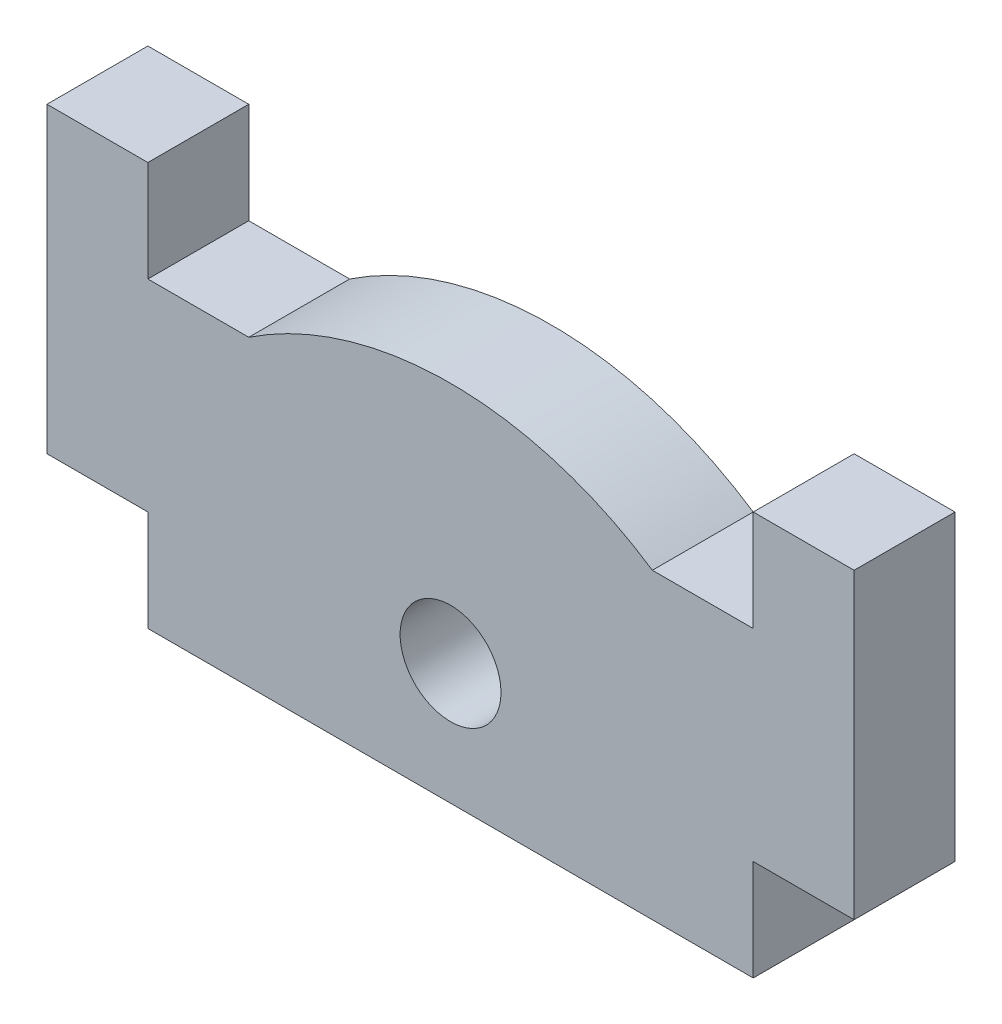
ISO-10303-21;
HEADER;
FILE_DESCRIPTION(('STEP AP214'),'2;1');
FILE_NAME('part.step','',(''),(''),'','','');
FILE_SCHEMA(('AUTOMOTIVE_DESIGN { 1 0 10303 214 1 1 1 1 }'));
ENDSEC;
DATA;
#1=APPLICATION_CONTEXT('core data for automotive mechanical design processes');
#2=APPLICATION_PROTOCOL_DEFINITION('international standard','automotive_design',2000,#1);
#3=PRODUCT_CONTEXT('',#1,'mechanical');
#4=PRODUCT('Part','Part','',(#3));
#5=PRODUCT_RELATED_PRODUCT_CATEGORY('part','',(#4));
#6=PRODUCT_DEFINITION_FORMATION('','',#4);
#7=PRODUCT_DEFINITION_CONTEXT('part definition',#1,'design');
#8=PRODUCT_DEFINITION('design','',#6,#7);
#9=PRODUCT_DEFINITION_SHAPE('','',#8);
#10=(LENGTH_UNIT() NAMED_UNIT(*) SI_UNIT(.MILLI.,.METRE.));
#11=(NAMED_UNIT(*) PLANE_ANGLE_UNIT() SI_UNIT($,.RADIAN.));
#12=(NAMED_UNIT(*) SI_UNIT($,.STERADIAN.) SOLID_ANGLE_UNIT());
#13=UNCERTAINTY_MEASURE_WITH_UNIT(LENGTH_MEASURE(1.E-05),#10,'distance_accuracy_value','');
#14=(GEOMETRIC_REPRESENTATION_CONTEXT(3) GLOBAL_UNCERTAINTY_ASSIGNED_CONTEXT((#13)) GLOBAL_UNIT_ASSIGNED_CONTEXT((#10,
#11,#12)) REPRESENTATION_CONTEXT('',''));
#15=CARTESIAN_POINT('',(0.,0.,0.));
#16=DIRECTION('',(0.,0.,1.));
#17=DIRECTION('',(1.,0.,0.));
#18=AXIS2_PLACEMENT_3D('',#15,#16,#17);
#19=CARTESIAN_POINT('',(0.,0.,2.));
#20=DIRECTION('',(0.,0.,1.));
#21=DIRECTION('',(1.,0.,0.));
#22=AXIS2_PLACEMENT_3D('',#19,#20,#21);
#23=PLANE('',#22);
#24=CARTESIAN_POINT('',(0.,0.,2.));
#25=DIRECTION('',(0.,0.,1.));
#26=DIRECTION('',(1.,0.,0.));
#27=AXIS2_PLACEMENT_3D('',#24,#25,#26);
#28=CIRCLE('',#27,7.21110255092798);
#29=CARTESIAN_POINT('',(4.,6.,2.));
#30=VERTEX_POINT('',#29);
#31=CARTESIAN_POINT('',(-4.,6.,2.));
#32=VERTEX_POINT('',#31);
#33=EDGE_CURVE('E194',#30,#32,#28,.T.);
#34=ORIENTED_EDGE('',*,*,#33,.T.);
#35=DIRECTION('',(-1.,0.,0.));
#36=VECTOR('',#35,1.);
#37=CARTESIAN_POINT('',(-4.,6.,2.));
#38=LINE('',#37,#36);
#39=CARTESIAN_POINT('',(-6.,6.,2.));
#40=VERTEX_POINT('',#39);
#41=EDGE_CURVE('E112',#32,#40,#38,.T.);
#42=ORIENTED_EDGE('',*,*,#41,.T.);
#43=DIRECTION('',(0.,1.,0.));
#44=VECTOR('',#43,1.);
#45=CARTESIAN_POINT('',(-6.,6.,2.));
#46=LINE('',#45,#44);
#47=CARTESIAN_POINT('',(-6.,8.,2.));
#48=VERTEX_POINT('',#47);
#49=EDGE_CURVE('E227',#40,#48,#46,.T.);
#50=ORIENTED_EDGE('',*,*,#49,.T.);
#51=DIRECTION('',(-1.,0.,0.));
#52=VECTOR('',#51,1.);
#53=CARTESIAN_POINT('',(-6.,8.,2.));
#54=LINE('',#53,#52);
#55=CARTESIAN_POINT('',(-8.,8.,2.));
#56=VERTEX_POINT('',#55);
#57=EDGE_CURVE('E246',#48,#56,#54,.T.);
#58=ORIENTED_EDGE('',*,*,#57,.T.);
#59=DIRECTION('',(0.,-1.,0.));
#60=VECTOR('',#59,1.);
#61=CARTESIAN_POINT('',(-8.,8.,2.));
#62=LINE('',#61,#60);
#63=CARTESIAN_POINT('',(-8.,2.,2.));
#64=VERTEX_POINT('',#63);
#65=EDGE_CURVE('E243',#56,#64,#62,.T.);
#66=ORIENTED_EDGE('',*,*,#65,.T.);
#67=DIRECTION('',(1.,0.,0.));
#68=VECTOR('',#67,1.);
#69=CARTESIAN_POINT('',(-8.,2.,2.));
#70=LINE('',#69,#68);
#71=CARTESIAN_POINT('',(-6.,2.,2.));
#72=VERTEX_POINT('',#71);
#73=EDGE_CURVE('E245',#64,#72,#70,.T.);
#74=ORIENTED_EDGE('',*,*,#73,.T.);
#75=DIRECTION('',(0.,-1.,0.));
#76=VECTOR('',#75,1.);
#77=CARTESIAN_POINT('',(-6.,2.,2.));
#78=LINE('',#77,#76);
#79=CARTESIAN_POINT('',(-6.,0.,2.));
#80=VERTEX_POINT('',#79);
#81=EDGE_CURVE('E248',#72,#80,#78,.T.);
#82=ORIENTED_EDGE('',*,*,#81,.T.);
#83=DIRECTION('',(1.,0.,0.));
#84=VECTOR('',#83,1.);
#85=CARTESIAN_POINT('',(6.,0.,2.));
#86=LINE('',#85,#84);
#87=CARTESIAN_POINT('',(6.,0.,2.));
#88=VERTEX_POINT('',#87);
#89=EDGE_CURVE('E254',#80,#88,#86,.T.);
#90=ORIENTED_EDGE('',*,*,#89,.T.);
#91=DIRECTION('',(0.,1.,0.));
#92=VECTOR('',#91,1.);
#93=CARTESIAN_POINT('',(6.,2.,2.));
#94=LINE('',#93,#92);
#95=CARTESIAN_POINT('',(6.,2.,2.));
#96=VERTEX_POINT('',#95);
#97=EDGE_CURVE('E256',#88,#96,#94,.T.);
#98=ORIENTED_EDGE('',*,*,#97,.T.);
#99=DIRECTION('',(1.,0.,0.));
#100=VECTOR('',#99,1.);
#101=CARTESIAN_POINT('',(8.,2.,2.));
#102=LINE('',#101,#100);
#103=CARTESIAN_POINT('',(8.,2.,2.));
#104=VERTEX_POINT('',#103);
#105=EDGE_CURVE('E258',#96,#104,#102,.T.);
#106=ORIENTED_EDGE('',*,*,#105,.T.);
#107=DIRECTION('',(0.,1.,0.));
#108=VECTOR('',#107,1.);
#109=CARTESIAN_POINT('',(8.,8.,2.));
#110=LINE('',#109,#108);
#111=CARTESIAN_POINT('',(8.,8.,2.));
#112=VERTEX_POINT('',#111);
#113=EDGE_CURVE('E149',#104,#112,#110,.T.);
#114=ORIENTED_EDGE('',*,*,#113,.T.);
#115=DIRECTION('',(-1.,0.,0.));
#116=VECTOR('',#115,1.);
#117=CARTESIAN_POINT('',(6.,8.,2.));
#118=LINE('',#117,#116);
#119=CARTESIAN_POINT('',(6.,8.,2.));
#120=VERTEX_POINT('',#119);
#121=EDGE_CURVE('E143',#112,#120,#118,.T.);
#122=ORIENTED_EDGE('',*,*,#121,.T.);
#123=DIRECTION('',(0.,-1.,0.));
#124=VECTOR('',#123,1.);
#125=CARTESIAN_POINT('',(6.,6.,2.));
#126=LINE('',#125,#124);
#127=CARTESIAN_POINT('',(6.,6.,2.));
#128=VERTEX_POINT('',#127);
#129=EDGE_CURVE('E147',#120,#128,#126,.T.);
#130=ORIENTED_EDGE('',*,*,#129,.T.);
#131=DIRECTION('',(-1.,0.,0.));
#132=VECTOR('',#131,1.);
#133=CARTESIAN_POINT('',(4.,6.,2.));
#134=LINE('',#133,#132);
#135=EDGE_CURVE('E51',#128,#30,#134,.T.);
#136=ORIENTED_EDGE('',*,*,#135,.T.);
#137=EDGE_LOOP('',(#34,#42,#50,#58,#66,#74,#82,#90,#98,#106,#114,#122,#130,#136));
#138=FACE_BOUND('',#137,.T.);
#139=CARTESIAN_POINT('',(0.,2.4,2.));
#140=DIRECTION('',(0.,0.,1.));
#141=DIRECTION('',(1.,0.,0.));
#142=AXIS2_PLACEMENT_3D('',#139,#140,#141);
#143=CIRCLE('',#142,1.);
#144=CARTESIAN_POINT('',(1.,2.4,2.));
#145=VERTEX_POINT('',#144);
#146=EDGE_CURVE('E171',#145,#145,#143,.T.);
#147=ORIENTED_EDGE('',*,*,#146,.F.);
#148=EDGE_LOOP('',(#147));
#149=FACE_BOUND('',#148,.T.);
#150=ADVANCED_FACE('F34',(#138,#149),#23,.T.);
#151=CARTESIAN_POINT('',(0.,0.,0.));
#152=DIRECTION('',(0.,0.,1.));
#153=DIRECTION('',(1.,0.,0.));
#154=AXIS2_PLACEMENT_3D('',#151,#152,#153);
#155=PLANE('',#154);
#156=CARTESIAN_POINT('',(0.,0.,0.));
#157=DIRECTION('',(0.,0.,1.));
#158=DIRECTION('',(1.,0.,0.));
#159=AXIS2_PLACEMENT_3D('',#156,#157,#158);
#160=CIRCLE('',#159,7.21110255092798);
#161=CARTESIAN_POINT('',(4.,6.,0.));
#162=VERTEX_POINT('',#161);
#163=CARTESIAN_POINT('',(-4.,6.,0.));
#164=VERTEX_POINT('',#163);
#165=EDGE_CURVE('E167',#162,#164,#160,.T.);
#166=ORIENTED_EDGE('',*,*,#165,.F.);
#167=DIRECTION('',(-1.,0.,0.));
#168=VECTOR('',#167,1.);
#169=CARTESIAN_POINT('',(4.,6.,0.));
#170=LINE('',#169,#168);
#171=CARTESIAN_POINT('',(6.,6.,0.));
#172=VERTEX_POINT('',#171);
#173=EDGE_CURVE('E104',#172,#162,#170,.T.);
#174=ORIENTED_EDGE('',*,*,#173,.F.);
#175=DIRECTION('',(0.,-1.,0.));
#176=VECTOR('',#175,1.);
#177=CARTESIAN_POINT('',(6.,6.,0.));
#178=LINE('',#177,#176);
#179=CARTESIAN_POINT('',(6.,8.,0.));
#180=VERTEX_POINT('',#179);
#181=EDGE_CURVE('E98',#180,#172,#178,.T.);
#182=ORIENTED_EDGE('',*,*,#181,.F.);
#183=DIRECTION('',(-1.,0.,0.));
#184=VECTOR('',#183,1.);
#185=CARTESIAN_POINT('',(6.,8.,0.));
#186=LINE('',#185,#184);
#187=CARTESIAN_POINT('',(8.,8.,0.));
#188=VERTEX_POINT('',#187);
#189=EDGE_CURVE('E157',#188,#180,#186,.T.);
#190=ORIENTED_EDGE('',*,*,#189,.F.);
#191=DIRECTION('',(0.,1.,0.));
#192=VECTOR('',#191,1.);
#193=CARTESIAN_POINT('',(8.,8.,0.));
#194=LINE('',#193,#192);
#195=CARTESIAN_POINT('',(8.,2.,0.));
#196=VERTEX_POINT('',#195);
#197=EDGE_CURVE('E189',#196,#188,#194,.T.);
#198=ORIENTED_EDGE('',*,*,#197,.F.);
#199=DIRECTION('',(1.,0.,0.));
#200=VECTOR('',#199,1.);
#201=CARTESIAN_POINT('',(8.,2.,0.));
#202=LINE('',#201,#200);
#203=CARTESIAN_POINT('',(6.,2.,0.));
#204=VERTEX_POINT('',#203);
#205=EDGE_CURVE('E187',#204,#196,#202,.T.);
#206=ORIENTED_EDGE('',*,*,#205,.F.);
#207=DIRECTION('',(0.,1.,0.));
#208=VECTOR('',#207,1.);
#209=CARTESIAN_POINT('',(6.,2.,0.));
#210=LINE('',#209,#208);
#211=CARTESIAN_POINT('',(6.,0.,0.));
#212=VERTEX_POINT('',#211);
#213=EDGE_CURVE('E185',#212,#204,#210,.T.);
#214=ORIENTED_EDGE('',*,*,#213,.F.);
#215=DIRECTION('',(1.,0.,0.));
#216=VECTOR('',#215,1.);
#217=CARTESIAN_POINT('',(6.,0.,0.));
#218=LINE('',#217,#216);
#219=CARTESIAN_POINT('',(-6.,0.,0.));
#220=VERTEX_POINT('',#219);
#221=EDGE_CURVE('E183',#220,#212,#218,.T.);
#222=ORIENTED_EDGE('',*,*,#221,.F.);
#223=DIRECTION('',(0.,-1.,0.));
#224=VECTOR('',#223,1.);
#225=CARTESIAN_POINT('',(-6.,2.,0.));
#226=LINE('',#225,#224);
#227=CARTESIAN_POINT('',(-6.,2.,0.));
#228=VERTEX_POINT('',#227);
#229=EDGE_CURVE('E181',#228,#220,#226,.T.);
#230=ORIENTED_EDGE('',*,*,#229,.F.);
#231=DIRECTION('',(1.,0.,0.));
#232=VECTOR('',#231,1.);
#233=CARTESIAN_POINT('',(-8.,2.,0.));
#234=LINE('',#233,#232);
#235=CARTESIAN_POINT('',(-8.,2.,0.));
#236=VERTEX_POINT('',#235);
#237=EDGE_CURVE('E179',#236,#228,#234,.T.);
#238=ORIENTED_EDGE('',*,*,#237,.F.);
#239=DIRECTION('',(0.,-1.,0.));
#240=VECTOR('',#239,1.);
#241=CARTESIAN_POINT('',(-8.,8.,0.));
#242=LINE('',#241,#240);
#243=CARTESIAN_POINT('',(-8.,8.,0.));
#244=VERTEX_POINT('',#243);
#245=EDGE_CURVE('E177',#244,#236,#242,.T.);
#246=ORIENTED_EDGE('',*,*,#245,.F.);
#247=DIRECTION('',(-1.,0.,0.));
#248=VECTOR('',#247,1.);
#249=CARTESIAN_POINT('',(-6.,8.,0.));
#250=LINE('',#249,#248);
#251=CARTESIAN_POINT('',(-6.,8.,0.));
#252=VERTEX_POINT('',#251);
#253=EDGE_CURVE('E175',#252,#244,#250,.T.);
#254=ORIENTED_EDGE('',*,*,#253,.F.);
#255=DIRECTION('',(0.,1.,0.));
#256=VECTOR('',#255,1.);
#257=CARTESIAN_POINT('',(-6.,6.,0.));
#258=LINE('',#257,#256);
#259=CARTESIAN_POINT('',(-6.,6.,0.));
#260=VERTEX_POINT('',#259);
#261=EDGE_CURVE('E173',#260,#252,#258,.T.);
#262=ORIENTED_EDGE('',*,*,#261,.F.);
#263=DIRECTION('',(-1.,0.,0.));
#264=VECTOR('',#263,1.);
#265=CARTESIAN_POINT('',(-4.,6.,0.));
#266=LINE('',#265,#264);
#267=EDGE_CURVE('E170',#164,#260,#266,.T.);
#268=ORIENTED_EDGE('',*,*,#267,.F.);
#269=EDGE_LOOP('',(#166,#174,#182,#190,#198,#206,#214,#222,#230,#238,#246,#254,#262,#268));
#270=FACE_BOUND('',#269,.T.);
#271=CARTESIAN_POINT('',(0.,2.4,0.));
#272=DIRECTION('',(0.,0.,1.));
#273=DIRECTION('',(1.,0.,0.));
#274=AXIS2_PLACEMENT_3D('',#271,#272,#273);
#275=CIRCLE('',#274,1.);
#276=CARTESIAN_POINT('',(1.,2.4,0.));
#277=VERTEX_POINT('',#276);
#278=EDGE_CURVE('E431',#277,#277,#275,.T.);
#279=ORIENTED_EDGE('',*,*,#278,.T.);
#280=EDGE_LOOP('',(#279));
#281=FACE_BOUND('',#280,.T.);
#282=ADVANCED_FACE('F231',(#270,#281),#155,.F.);
#283=CARTESIAN_POINT('',(0.,0.,2.));
#284=DIRECTION('',(0.,0.,-1.));
#285=DIRECTION('',(-1.,0.,0.));
#286=AXIS2_PLACEMENT_3D('',#283,#284,#285);
#287=CYLINDRICAL_SURFACE('',#286,7.21110255092798);
#288=ORIENTED_EDGE('',*,*,#165,.T.);
#289=DIRECTION('',(0.,0.,-1.));
#290=VECTOR('',#289,1.);
#291=CARTESIAN_POINT('',(-4.,6.,2.));
#292=LINE('',#291,#290);
#293=EDGE_CURVE('E11',#32,#164,#292,.T.);
#294=ORIENTED_EDGE('',*,*,#293,.F.);
#295=ORIENTED_EDGE('',*,*,#33,.F.);
#296=DIRECTION('',(0.,0.,-1.));
#297=VECTOR('',#296,1.);
#298=CARTESIAN_POINT('',(4.,6.,2.));
#299=LINE('',#298,#297);
#300=EDGE_CURVE('E163',#30,#162,#299,.T.);
#301=ORIENTED_EDGE('',*,*,#300,.T.);
#302=EDGE_LOOP('',(#288,#294,#295,#301));
#303=FACE_BOUND('',#302,.T.);
#304=ADVANCED_FACE('F36',(#303),#287,.T.);
#305=CARTESIAN_POINT('',(-4.,6.,2.));
#306=DIRECTION('',(0.,-1.,0.));
#307=DIRECTION('',(0.,0.,-1.));
#308=AXIS2_PLACEMENT_3D('',#305,#306,#307);
#309=PLANE('',#308);
#310=ORIENTED_EDGE('',*,*,#267,.T.);
#311=DIRECTION('',(0.,0.,-1.));
#312=VECTOR('',#311,1.);
#313=CARTESIAN_POINT('',(-6.,6.,2.));
#314=LINE('',#313,#312);
#315=EDGE_CURVE('E43',#40,#260,#314,.T.);
#316=ORIENTED_EDGE('',*,*,#315,.F.);
#317=ORIENTED_EDGE('',*,*,#41,.F.);
#318=ORIENTED_EDGE('',*,*,#293,.T.);
#319=EDGE_LOOP('',(#310,#316,#317,#318));
#320=FACE_BOUND('',#319,.T.);
#321=ADVANCED_FACE('F292',(#320),#309,.F.);
#322=CARTESIAN_POINT('',(-6.,6.,2.));
#323=DIRECTION('',(-1.,0.,0.));
#324=DIRECTION('',(0.,0.,1.));
#325=AXIS2_PLACEMENT_3D('',#322,#323,#324);
#326=PLANE('',#325);
#327=ORIENTED_EDGE('',*,*,#261,.T.);
#328=DIRECTION('',(0.,0.,-1.));
#329=VECTOR('',#328,1.);
#330=CARTESIAN_POINT('',(-6.,8.,2.));
#331=LINE('',#330,#329);
#332=EDGE_CURVE('E219',#48,#252,#331,.T.);
#333=ORIENTED_EDGE('',*,*,#332,.F.);
#334=ORIENTED_EDGE('',*,*,#49,.F.);
#335=ORIENTED_EDGE('',*,*,#315,.T.);
#336=EDGE_LOOP('',(#327,#333,#334,#335));
#337=FACE_BOUND('',#336,.T.);
#338=ADVANCED_FACE('F225',(#337),#326,.F.);
#339=CARTESIAN_POINT('',(-6.,8.,2.));
#340=DIRECTION('',(0.,-1.,0.));
#341=DIRECTION('',(0.,0.,-1.));
#342=AXIS2_PLACEMENT_3D('',#339,#340,#341);
#343=PLANE('',#342);
#344=ORIENTED_EDGE('',*,*,#253,.T.);
#345=DIRECTION('',(0.,0.,-1.));
#346=VECTOR('',#345,1.);
#347=CARTESIAN_POINT('',(-8.,8.,2.));
#348=LINE('',#347,#346);
#349=EDGE_CURVE('E216',#56,#244,#348,.T.);
#350=ORIENTED_EDGE('',*,*,#349,.F.);
#351=ORIENTED_EDGE('',*,*,#57,.F.);
#352=ORIENTED_EDGE('',*,*,#332,.T.);
#353=EDGE_LOOP('',(#344,#350,#351,#352));
#354=FACE_BOUND('',#353,.T.);
#355=ADVANCED_FACE('F237',(#354),#343,.F.);
#356=CARTESIAN_POINT('',(-8.,8.,2.));
#357=DIRECTION('',(1.,0.,0.));
#358=DIRECTION('',(0.,1.,0.));
#359=AXIS2_PLACEMENT_3D('',#356,#357,#358);
#360=PLANE('',#359);
#361=ORIENTED_EDGE('',*,*,#245,.T.);
#362=DIRECTION('',(0.,0.,-1.));
#363=VECTOR('',#362,1.);
#364=CARTESIAN_POINT('',(-8.,2.,2.));
#365=LINE('',#364,#363);
#366=EDGE_CURVE('E213',#64,#236,#365,.T.);
#367=ORIENTED_EDGE('',*,*,#366,.F.);
#368=ORIENTED_EDGE('',*,*,#65,.F.);
#369=ORIENTED_EDGE('',*,*,#349,.T.);
#370=EDGE_LOOP('',(#361,#367,#368,#369));
#371=FACE_BOUND('',#370,.T.);
#372=ADVANCED_FACE('F241',(#371),#360,.F.);
#373=CARTESIAN_POINT('',(-8.,2.,2.));
#374=DIRECTION('',(0.,1.,0.));
#375=DIRECTION('',(-1.,0.,0.));
#376=AXIS2_PLACEMENT_3D('',#373,#374,#375);
#377=PLANE('',#376);
#378=ORIENTED_EDGE('',*,*,#237,.T.);
#379=DIRECTION('',(0.,0.,-1.));
#380=VECTOR('',#379,1.);
#381=CARTESIAN_POINT('',(-6.,2.,2.));
#382=LINE('',#381,#380);
#383=EDGE_CURVE('E210',#72,#228,#382,.T.);
#384=ORIENTED_EDGE('',*,*,#383,.F.);
#385=ORIENTED_EDGE('',*,*,#73,.F.);
#386=ORIENTED_EDGE('',*,*,#366,.T.);
#387=EDGE_LOOP('',(#378,#384,#385,#386));
#388=FACE_BOUND('',#387,.T.);
#389=ADVANCED_FACE('F305',(#388),#377,.F.);
#390=CARTESIAN_POINT('',(-6.,2.,2.));
#391=DIRECTION('',(1.,0.,0.));
#392=DIRECTION('',(0.,0.,-1.));
#393=AXIS2_PLACEMENT_3D('',#390,#391,#392);
#394=PLANE('',#393);
#395=ORIENTED_EDGE('',*,*,#229,.T.);
#396=DIRECTION('',(0.,0.,-1.));
#397=VECTOR('',#396,1.);
#398=CARTESIAN_POINT('',(-6.,0.,2.));
#399=LINE('',#398,#397);
#400=EDGE_CURVE('E207',#80,#220,#399,.T.);
#401=ORIENTED_EDGE('',*,*,#400,.F.);
#402=ORIENTED_EDGE('',*,*,#81,.F.);
#403=ORIENTED_EDGE('',*,*,#383,.T.);
#404=EDGE_LOOP('',(#395,#401,#402,#403));
#405=FACE_BOUND('',#404,.T.);
#406=ADVANCED_FACE('F308',(#405),#394,.F.);
#407=CARTESIAN_POINT('',(6.,0.,2.));
#408=DIRECTION('',(0.,1.,0.));
#409=DIRECTION('',(0.,0.,1.));
#410=AXIS2_PLACEMENT_3D('',#407,#408,#409);
#411=PLANE('',#410);
#412=ORIENTED_EDGE('',*,*,#221,.T.);
#413=DIRECTION('',(0.,0.,-1.));
#414=VECTOR('',#413,1.);
#415=CARTESIAN_POINT('',(6.,0.,2.));
#416=LINE('',#415,#414);
#417=EDGE_CURVE('E204',#88,#212,#416,.T.);
#418=ORIENTED_EDGE('',*,*,#417,.F.);
#419=ORIENTED_EDGE('',*,*,#89,.F.);
#420=ORIENTED_EDGE('',*,*,#400,.T.);
#421=EDGE_LOOP('',(#412,#418,#419,#420));
#422=FACE_BOUND('',#421,.T.);
#423=ADVANCED_FACE('F312',(#422),#411,.F.);
#424=CARTESIAN_POINT('',(6.,2.,2.));
#425=DIRECTION('',(-1.,0.,0.));
#426=DIRECTION('',(0.,0.,1.));
#427=AXIS2_PLACEMENT_3D('',#424,#425,#426);
#428=PLANE('',#427);
#429=ORIENTED_EDGE('',*,*,#213,.T.);
#430=DIRECTION('',(0.,0.,-1.));
#431=VECTOR('',#430,1.);
#432=CARTESIAN_POINT('',(6.,2.,2.));
#433=LINE('',#432,#431);
#434=EDGE_CURVE('E201',#96,#204,#433,.T.);
#435=ORIENTED_EDGE('',*,*,#434,.F.);
#436=ORIENTED_EDGE('',*,*,#97,.F.);
#437=ORIENTED_EDGE('',*,*,#417,.T.);
#438=EDGE_LOOP('',(#429,#435,#436,#437));
#439=FACE_BOUND('',#438,.T.);
#440=ADVANCED_FACE('F316',(#439),#428,.F.);
#441=CARTESIAN_POINT('',(8.,2.,2.));
#442=DIRECTION('',(0.,1.,0.));
#443=DIRECTION('',(-1.,0.,0.));
#444=AXIS2_PLACEMENT_3D('',#441,#442,#443);
#445=PLANE('',#444);
#446=ORIENTED_EDGE('',*,*,#205,.T.);
#447=DIRECTION('',(0.,0.,-1.));
#448=VECTOR('',#447,1.);
#449=CARTESIAN_POINT('',(8.,2.,2.));
#450=LINE('',#449,#448);
#451=EDGE_CURVE('E198',#104,#196,#450,.T.);
#452=ORIENTED_EDGE('',*,*,#451,.F.);
#453=ORIENTED_EDGE('',*,*,#105,.F.);
#454=ORIENTED_EDGE('',*,*,#434,.T.);
#455=EDGE_LOOP('',(#446,#452,#453,#454));
#456=FACE_BOUND('',#455,.T.);
#457=ADVANCED_FACE('F264',(#456),#445,.F.);
#458=CARTESIAN_POINT('',(8.,8.,2.));
#459=DIRECTION('',(-1.,0.,0.));
#460=DIRECTION('',(0.,-1.,0.));
#461=AXIS2_PLACEMENT_3D('',#458,#459,#460);
#462=PLANE('',#461);
#463=ORIENTED_EDGE('',*,*,#197,.T.);
#464=DIRECTION('',(0.,0.,-1.));
#465=VECTOR('',#464,1.);
#466=CARTESIAN_POINT('',(8.,8.,2.));
#467=LINE('',#466,#465);
#468=EDGE_CURVE('E158',#112,#188,#467,.T.);
#469=ORIENTED_EDGE('',*,*,#468,.F.);
#470=ORIENTED_EDGE('',*,*,#113,.F.);
#471=ORIENTED_EDGE('',*,*,#451,.T.);
#472=EDGE_LOOP('',(#463,#469,#470,#471));
#473=FACE_BOUND('',#472,.T.);
#474=ADVANCED_FACE('F268',(#473),#462,.F.);
#475=CARTESIAN_POINT('',(6.,8.,2.));
#476=DIRECTION('',(0.,-1.,0.));
#477=DIRECTION('',(0.,0.,-1.));
#478=AXIS2_PLACEMENT_3D('',#475,#476,#477);
#479=PLANE('',#478);
#480=ORIENTED_EDGE('',*,*,#189,.T.);
#481=DIRECTION('',(0.,0.,-1.));
#482=VECTOR('',#481,1.);
#483=CARTESIAN_POINT('',(6.,8.,2.));
#484=LINE('',#483,#482);
#485=EDGE_CURVE('E154',#120,#180,#484,.T.);
#486=ORIENTED_EDGE('',*,*,#485,.F.);
#487=ORIENTED_EDGE('',*,*,#121,.F.);
#488=ORIENTED_EDGE('',*,*,#468,.T.);
#489=EDGE_LOOP('',(#480,#486,#487,#488));
#490=FACE_BOUND('',#489,.T.);
#491=ADVANCED_FACE('F155',(#490),#479,.F.);
#492=CARTESIAN_POINT('',(6.,6.,2.));
#493=DIRECTION('',(1.,0.,0.));
#494=DIRECTION('',(0.,0.,-1.));
#495=AXIS2_PLACEMENT_3D('',#492,#493,#494);
#496=PLANE('',#495);
#497=ORIENTED_EDGE('',*,*,#181,.T.);
#498=DIRECTION('',(0.,0.,-1.));
#499=VECTOR('',#498,1.);
#500=CARTESIAN_POINT('',(6.,6.,2.));
#501=LINE('',#500,#499);
#502=EDGE_CURVE('E159',#128,#172,#501,.T.);
#503=ORIENTED_EDGE('',*,*,#502,.F.);
#504=ORIENTED_EDGE('',*,*,#129,.F.);
#505=ORIENTED_EDGE('',*,*,#485,.T.);
#506=EDGE_LOOP('',(#497,#503,#504,#505));
#507=FACE_BOUND('',#506,.T.);
#508=ADVANCED_FACE('F161',(#507),#496,.F.);
#509=CARTESIAN_POINT('',(4.,6.,2.));
#510=DIRECTION('',(0.,-1.,0.));
#511=DIRECTION('',(0.,0.,-1.));
#512=AXIS2_PLACEMENT_3D('',#509,#510,#511);
#513=PLANE('',#512);
#514=ORIENTED_EDGE('',*,*,#173,.T.);
#515=ORIENTED_EDGE('',*,*,#300,.F.);
#516=ORIENTED_EDGE('',*,*,#135,.F.);
#517=ORIENTED_EDGE('',*,*,#502,.T.);
#518=EDGE_LOOP('',(#514,#515,#516,#517));
#519=FACE_BOUND('',#518,.T.);
#520=ADVANCED_FACE('F272',(#519),#513,.F.);
#521=CARTESIAN_POINT('',(0.,2.4,2.));
#522=DIRECTION('',(0.,0.,-1.));
#523=DIRECTION('',(-1.,0.,0.));
#524=AXIS2_PLACEMENT_3D('',#521,#522,#523);
#525=CYLINDRICAL_SURFACE('',#524,1.);
#526=ORIENTED_EDGE('',*,*,#146,.T.);
#527=EDGE_LOOP('',(#526));
#528=FACE_BOUND('',#527,.T.);
#529=ORIENTED_EDGE('',*,*,#278,.F.);
#530=EDGE_LOOP('',(#529));
#531=FACE_BOUND('',#530,.T.);
#532=ADVANCED_FACE('F274',(#528,#531),#525,.F.);
#533=CLOSED_SHELL('',(#150,#282,#304,#321,#338,#355,#372,#389,#406,#423,#440,#457,#474,#491,
#508,#520,#532));
#534=MANIFOLD_SOLID_BREP('B2',#533);
#535=ADVANCED_BREP_SHAPE_REPRESENTATION('',(#18,#534),#14);
#536=SHAPE_DEFINITION_REPRESENTATION(#9,#535);
ENDSEC;
END-ISO-10303-21;
